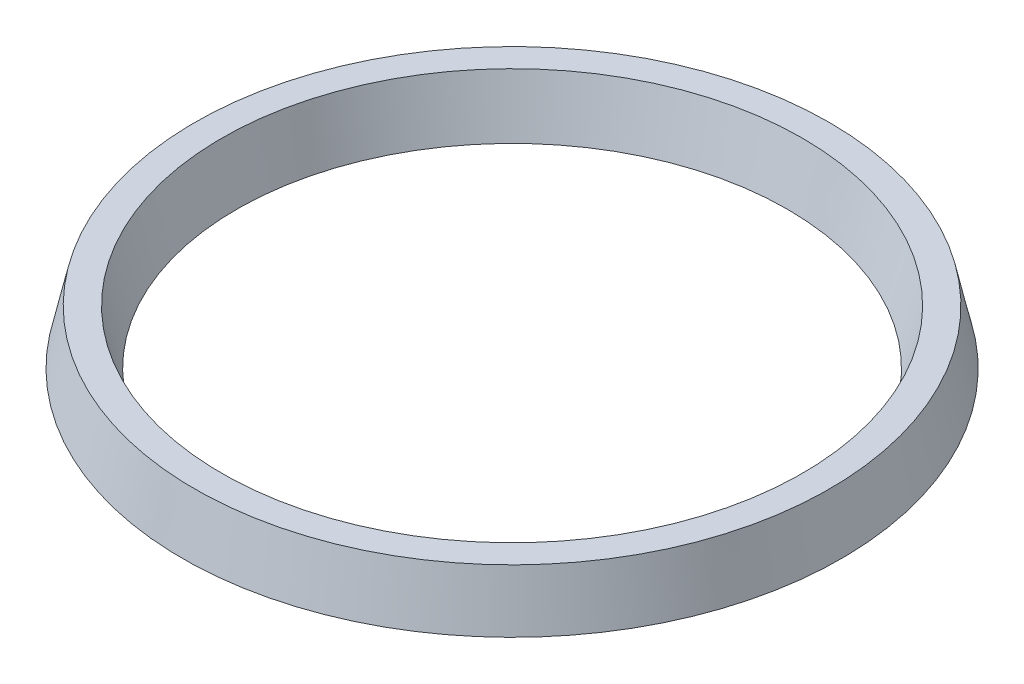
ISO-10303-21;
HEADER;
FILE_DESCRIPTION(('STEP AP214'),'2;1');
FILE_NAME('part.step','',(''),(''),'','','');
FILE_SCHEMA(('AUTOMOTIVE_DESIGN { 1 0 10303 214 1 1 1 1 }'));
ENDSEC;
DATA;
#1=APPLICATION_CONTEXT('core data for automotive mechanical design processes');
#2=APPLICATION_PROTOCOL_DEFINITION('international standard','automotive_design',2000,#1);
#3=PRODUCT_CONTEXT('',#1,'mechanical');
#4=PRODUCT('Part','Part','',(#3));
#5=PRODUCT_RELATED_PRODUCT_CATEGORY('part','',(#4));
#6=PRODUCT_DEFINITION_FORMATION('','',#4);
#7=PRODUCT_DEFINITION_CONTEXT('part definition',#1,'design');
#8=PRODUCT_DEFINITION('design','',#6,#7);
#9=PRODUCT_DEFINITION_SHAPE('','',#8);
#10=(LENGTH_UNIT() NAMED_UNIT(*) SI_UNIT(.MILLI.,.METRE.));
#11=(NAMED_UNIT(*) PLANE_ANGLE_UNIT() SI_UNIT($,.RADIAN.));
#12=(NAMED_UNIT(*) SI_UNIT($,.STERADIAN.) SOLID_ANGLE_UNIT());
#13=UNCERTAINTY_MEASURE_WITH_UNIT(LENGTH_MEASURE(1.E-05),#10,'distance_accuracy_value','');
#14=(GEOMETRIC_REPRESENTATION_CONTEXT(3) GLOBAL_UNCERTAINTY_ASSIGNED_CONTEXT((#13)) GLOBAL_UNIT_ASSIGNED_CONTEXT((#10,
#11,#12)) REPRESENTATION_CONTEXT('',''));
#15=CARTESIAN_POINT('',(0.,0.,0.));
#16=DIRECTION('',(0.,0.,1.));
#17=DIRECTION('',(1.,0.,0.));
#18=AXIS2_PLACEMENT_3D('',#15,#16,#17);
#19=CARTESIAN_POINT('',(-6.30493377093121,-6.,0.));
#20=DIRECTION('',(0.,-1.,0.));
#21=DIRECTION('',(0.,0.,-1.));
#22=AXIS2_PLACEMENT_3D('',#19,#20,#21);
#23=PLANE('',#22);
#24=CARTESIAN_POINT('',(-67.31,-6.,0.));
#25=DIRECTION('',(0.,-1.,0.));
#26=DIRECTION('',(0.,0.,-1.));
#27=AXIS2_PLACEMENT_3D('',#24,#25,#26);
#28=CIRCLE('',#27,64.0050662290688);
#29=CARTESIAN_POINT('',(-67.31,-6.,-64.0050662290688));
#30=VERTEX_POINT('',#29);
#31=EDGE_CURVE('E59',#30,#30,#28,.T.);
#32=ORIENTED_EDGE('',*,*,#31,.T.);
#33=EDGE_LOOP('',(#32));
#34=FACE_BOUND('',#33,.T.);
#35=CARTESIAN_POINT('',(-67.31,-6.,0.));
#36=DIRECTION('',(0.,-1.,0.));
#37=DIRECTION('',(0.,0.,-1.));
#38=AXIS2_PLACEMENT_3D('',#35,#36,#37);
#39=CIRCLE('',#38,61.0050662290688);
#40=CARTESIAN_POINT('',(-67.31,-6.,-61.0050662290688));
#41=VERTEX_POINT('',#40);
#42=EDGE_CURVE('E10',#41,#41,#39,.T.);
#43=ORIENTED_EDGE('',*,*,#42,.F.);
#44=EDGE_LOOP('',(#43));
#45=FACE_BOUND('',#44,.T.);
#46=ADVANCED_FACE('F31',(#34,#45),#23,.T.);
#47=CARTESIAN_POINT('',(-67.31,6.,0.));
#48=DIRECTION('',(0.,1.,0.));
#49=DIRECTION('',(0.,0.,1.));
#50=AXIS2_PLACEMENT_3D('',#47,#48,#49);
#51=CONICAL_SURFACE('',#50,64.31,0.268748411341808);
#52=ORIENTED_EDGE('',*,*,#42,.T.);
#53=EDGE_LOOP('',(#52));
#54=FACE_BOUND('',#53,.T.);
#55=CARTESIAN_POINT('',(-67.31,6.,0.));
#56=DIRECTION('',(0.,-1.,0.));
#57=DIRECTION('',(0.,0.,-1.));
#58=AXIS2_PLACEMENT_3D('',#55,#56,#57);
#59=CIRCLE('',#58,64.31);
#60=CARTESIAN_POINT('',(-67.31,6.,-64.31));
#61=VERTEX_POINT('',#60);
#62=EDGE_CURVE('E37',#61,#61,#59,.T.);
#63=ORIENTED_EDGE('',*,*,#62,.F.);
#64=EDGE_LOOP('',(#63));
#65=FACE_BOUND('',#64,.T.);
#66=ADVANCED_FACE('F77',(#54,#65),#51,.F.);
#67=CARTESIAN_POINT('',(3.,6.,0.));
#68=DIRECTION('',(0.,1.,0.));
#69=DIRECTION('',(0.,0.,1.));
#70=AXIS2_PLACEMENT_3D('',#67,#68,#69);
#71=PLANE('',#70);
#72=ORIENTED_EDGE('',*,*,#62,.T.);
#73=EDGE_LOOP('',(#72));
#74=FACE_BOUND('',#73,.T.);
#75=CARTESIAN_POINT('',(-67.31,6.,0.));
#76=DIRECTION('',(0.,-1.,0.));
#77=DIRECTION('',(0.,0.,-1.));
#78=AXIS2_PLACEMENT_3D('',#75,#76,#77);
#79=CIRCLE('',#78,70.31);
#80=CARTESIAN_POINT('',(-67.31,6.,-70.31));
#81=VERTEX_POINT('',#80);
#82=EDGE_CURVE('E41',#81,#81,#79,.T.);
#83=ORIENTED_EDGE('',*,*,#82,.F.);
#84=EDGE_LOOP('',(#83));
#85=FACE_BOUND('',#84,.T.);
#86=ADVANCED_FACE('F81',(#74,#85),#71,.T.);
#87=CARTESIAN_POINT('',(-67.31,-6.,0.));
#88=DIRECTION('',(0.,-1.,0.));
#89=DIRECTION('',(0.,0.,-1.));
#90=AXIS2_PLACEMENT_3D('',#87,#88,#89);
#91=CONICAL_SURFACE('',#90,73.0050662290688,0.220923071724017);
#92=ORIENTED_EDGE('',*,*,#82,.T.);
#93=EDGE_LOOP('',(#92));
#94=FACE_BOUND('',#93,.T.);
#95=CARTESIAN_POINT('',(-67.31,-6.,0.));
#96=DIRECTION('',(0.,-1.,0.));
#97=DIRECTION('',(0.,0.,-1.));
#98=AXIS2_PLACEMENT_3D('',#95,#96,#97);
#99=CIRCLE('',#98,73.0050662290688);
#100=CARTESIAN_POINT('',(-67.31,-6.,-73.0050662290688));
#101=VERTEX_POINT('',#100);
#102=EDGE_CURVE('E45',#101,#101,#99,.T.);
#103=ORIENTED_EDGE('',*,*,#102,.F.);
#104=EDGE_LOOP('',(#103));
#105=FACE_BOUND('',#104,.T.);
#106=ADVANCED_FACE('F85',(#94,#105),#91,.T.);
#107=CARTESIAN_POINT('',(2.69506622906879,-6.,0.));
#108=DIRECTION('',(0.,-1.,0.));
#109=DIRECTION('',(0.,0.,-1.));
#110=AXIS2_PLACEMENT_3D('',#107,#108,#109);
#111=PLANE('',#110);
#112=ORIENTED_EDGE('',*,*,#102,.T.);
#113=EDGE_LOOP('',(#112));
#114=FACE_BOUND('',#113,.T.);
#115=CARTESIAN_POINT('',(-67.31,-6.,0.));
#116=DIRECTION('',(0.,-1.,0.));
#117=DIRECTION('',(0.,0.,-1.));
#118=AXIS2_PLACEMENT_3D('',#115,#116,#117);
#119=CIRCLE('',#118,70.0050662290688);
#120=CARTESIAN_POINT('',(-67.31,-6.,-70.0050662290688));
#121=VERTEX_POINT('',#120);
#122=EDGE_CURVE('E50',#121,#121,#119,.T.);
#123=ORIENTED_EDGE('',*,*,#122,.F.);
#124=EDGE_LOOP('',(#123));
#125=FACE_BOUND('',#124,.T.);
#126=ADVANCED_FACE('F91',(#114,#125),#111,.T.);
#127=CARTESIAN_POINT('',(-67.31,-1.48792444348575,0.));
#128=DIRECTION('',(0.,-1.,0.));
#129=DIRECTION('',(0.,0.,-1.));
#130=AXIS2_PLACEMENT_3D('',#127,#128,#129);
#131=CONICAL_SURFACE('',#130,68.9917043577881,0.220923071724017);
#132=ORIENTED_EDGE('',*,*,#122,.T.);
#133=EDGE_LOOP('',(#132));
#134=FACE_BOUND('',#133,.T.);
#135=CARTESIAN_POINT('',(-67.31,-1.48792444348575,0.));
#136=DIRECTION('',(0.,-1.,0.));
#137=DIRECTION('',(0.,0.,-1.));
#138=AXIS2_PLACEMENT_3D('',#135,#136,#137);
#139=CIRCLE('',#138,68.9917043577881);
#140=CARTESIAN_POINT('',(-67.31,-1.48792444348575,-68.9917043577881));
#141=VERTEX_POINT('',#140);
#142=EDGE_CURVE('E53',#141,#141,#139,.T.);
#143=ORIENTED_EDGE('',*,*,#142,.F.);
#144=EDGE_LOOP('',(#143));
#145=FACE_BOUND('',#144,.T.);
#146=ADVANCED_FACE('F73',(#134,#145),#131,.F.);
#147=CARTESIAN_POINT('',(-67.31,-1.90809516819624,0.));
#148=DIRECTION('',(0.,-1.,0.));
#149=DIRECTION('',(0.,0.,-1.));
#150=AXIS2_PLACEMENT_3D('',#147,#148,#149);
#151=TOROIDAL_SURFACE('',#150,67.1208602790257,1.91744648033369);
#152=ORIENTED_EDGE('',*,*,#142,.T.);
#153=EDGE_LOOP('',(#152));
#154=FACE_BOUND('',#153,.T.);
#155=CARTESIAN_POINT('',(-67.31,-1.39896522339882,0.));
#156=DIRECTION('',(0.,-1.,0.));
#157=DIRECTION('',(0.,0.,-1.));
#158=AXIS2_PLACEMENT_3D('',#155,#156,#157);
#159=CIRCLE('',#158,65.272242496937);
#160=CARTESIAN_POINT('',(-67.31,-1.39896522339882,-65.272242496937));
#161=VERTEX_POINT('',#160);
#162=EDGE_CURVE('E56',#161,#161,#159,.T.);
#163=ORIENTED_EDGE('',*,*,#162,.F.);
#164=EDGE_LOOP('',(#163));
#165=FACE_BOUND('',#164,.T.);
#166=ADVANCED_FACE('F67',(#154,#165),#151,.F.);
#167=CARTESIAN_POINT('',(-67.31,-6.,0.));
#168=DIRECTION('',(0.,1.,0.));
#169=DIRECTION('',(0.,0.,1.));
#170=AXIS2_PLACEMENT_3D('',#167,#168,#169);
#171=CONICAL_SURFACE('',#170,64.0050662290688,0.268748411341805);
#172=ORIENTED_EDGE('',*,*,#162,.T.);
#173=EDGE_LOOP('',(#172));
#174=FACE_BOUND('',#173,.T.);
#175=ORIENTED_EDGE('',*,*,#31,.F.);
#176=EDGE_LOOP('',(#175));
#177=FACE_BOUND('',#176,.T.);
#178=ADVANCED_FACE('F65',(#174,#177),#171,.T.);
#179=CLOSED_SHELL('',(#46,#66,#86,#106,#126,#146,#166,#178));
#180=MANIFOLD_SOLID_BREP('B2',#179);
#181=ADVANCED_BREP_SHAPE_REPRESENTATION('',(#18,#180),#14);
#182=SHAPE_DEFINITION_REPRESENTATION(#9,#181);
ENDSEC;
END-ISO-10303-21;
